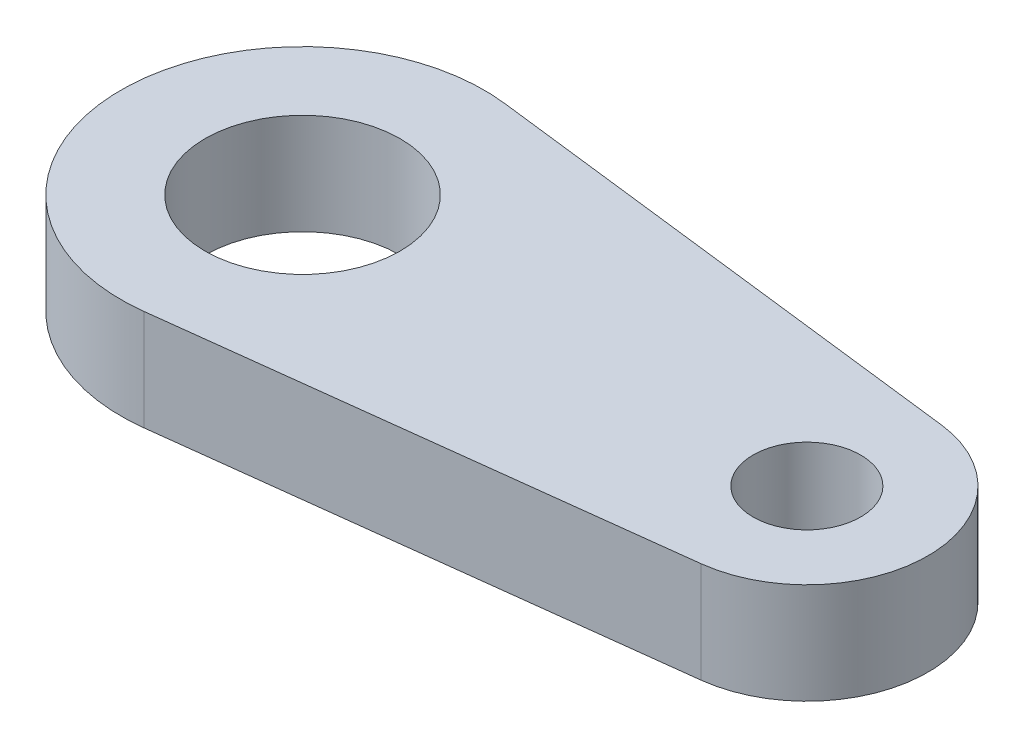
ISO-10303-21;
HEADER;
FILE_DESCRIPTION(('STEP AP214'),'2;1');
FILE_NAME('part.step','',(''),(''),'','','');
FILE_SCHEMA(('AUTOMOTIVE_DESIGN { 1 0 10303 214 1 1 1 1 }'));
ENDSEC;
DATA;
#1=APPLICATION_CONTEXT('core data for automotive mechanical design processes');
#2=APPLICATION_PROTOCOL_DEFINITION('international standard','automotive_design',2000,#1);
#3=PRODUCT_CONTEXT('',#1,'mechanical');
#4=PRODUCT('Part','Part','',(#3));
#5=PRODUCT_RELATED_PRODUCT_CATEGORY('part','',(#4));
#6=PRODUCT_DEFINITION_FORMATION('','',#4);
#7=PRODUCT_DEFINITION_CONTEXT('part definition',#1,'design');
#8=PRODUCT_DEFINITION('design','',#6,#7);
#9=PRODUCT_DEFINITION_SHAPE('','',#8);
#10=(LENGTH_UNIT() NAMED_UNIT(*) SI_UNIT(.MILLI.,.METRE.));
#11=(NAMED_UNIT(*) PLANE_ANGLE_UNIT() SI_UNIT($,.RADIAN.));
#12=(NAMED_UNIT(*) SI_UNIT($,.STERADIAN.) SOLID_ANGLE_UNIT());
#13=UNCERTAINTY_MEASURE_WITH_UNIT(LENGTH_MEASURE(1.E-05),#10,'distance_accuracy_value','');
#14=(GEOMETRIC_REPRESENTATION_CONTEXT(3) GLOBAL_UNCERTAINTY_ASSIGNED_CONTEXT((#13)) GLOBAL_UNIT_ASSIGNED_CONTEXT((#10,
#11,#12)) REPRESENTATION_CONTEXT('',''));
#15=CARTESIAN_POINT('',(0.,0.,0.));
#16=DIRECTION('',(0.,0.,1.));
#17=DIRECTION('',(1.,0.,0.));
#18=AXIS2_PLACEMENT_3D('',#15,#16,#17);
#19=CARTESIAN_POINT('',(15.,3.,0.));
#20=DIRECTION('',(0.,-1.,0.));
#21=DIRECTION('',(0.,0.,-1.));
#22=AXIS2_PLACEMENT_3D('',#19,#20,#21);
#23=CYLINDRICAL_SURFACE('',#22,3.6);
#24=CARTESIAN_POINT('',(15.,0.,0.));
#25=DIRECTION('',(0.,1.,0.));
#26=DIRECTION('',(0.,0.,1.));
#27=AXIS2_PLACEMENT_3D('',#24,#25,#26);
#28=CIRCLE('',#27,3.6);
#29=CARTESIAN_POINT('',(15.432,0.,3.57398601004537));
#30=VERTEX_POINT('',#29);
#31=CARTESIAN_POINT('',(15.432,0.,-3.57398601004537));
#32=VERTEX_POINT('',#31);
#33=EDGE_CURVE('E96',#30,#32,#28,.T.);
#34=ORIENTED_EDGE('',*,*,#33,.T.);
#35=DIRECTION('',(0.,-1.,0.));
#36=VECTOR('',#35,1.);
#37=CARTESIAN_POINT('',(15.432,3.,-3.57398601004537));
#38=LINE('',#37,#36);
#39=CARTESIAN_POINT('',(15.432,3.,-3.57398601004537));
#40=VERTEX_POINT('',#39);
#41=EDGE_CURVE('E11',#40,#32,#38,.T.);
#42=ORIENTED_EDGE('',*,*,#41,.F.);
#43=CARTESIAN_POINT('',(15.,3.,0.));
#44=DIRECTION('',(0.,1.,0.));
#45=DIRECTION('',(0.,0.,1.));
#46=AXIS2_PLACEMENT_3D('',#43,#44,#45);
#47=CIRCLE('',#46,3.6);
#48=CARTESIAN_POINT('',(15.432,3.,3.57398601004537));
#49=VERTEX_POINT('',#48);
#50=EDGE_CURVE('E84',#49,#40,#47,.T.);
#51=ORIENTED_EDGE('',*,*,#50,.F.);
#52=DIRECTION('',(0.,-1.,0.));
#53=VECTOR('',#52,1.);
#54=CARTESIAN_POINT('',(15.432,3.,3.57398601004537));
#55=LINE('',#54,#53);
#56=EDGE_CURVE('E92',#49,#30,#55,.T.);
#57=ORIENTED_EDGE('',*,*,#56,.T.);
#58=EDGE_LOOP('',(#34,#42,#51,#57));
#59=FACE_BOUND('',#58,.T.);
#60=ADVANCED_FACE('F33',(#59),#23,.T.);
#61=CARTESIAN_POINT('',(0.648,3.,-5.36097901506805));
#62=DIRECTION('',(-0.12,0.,0.992773891679269));
#63=DIRECTION('',(0.992773891679269,0.,0.12));
#64=AXIS2_PLACEMENT_3D('',#61,#62,#63);
#65=PLANE('',#64);
#66=DIRECTION('',(-0.992773891679269,0.,-0.12));
#67=VECTOR('',#66,1.);
#68=CARTESIAN_POINT('',(0.648,0.,-5.36097901506805));
#69=LINE('',#68,#67);
#70=CARTESIAN_POINT('',(0.648,0.,-5.36097901506805));
#71=VERTEX_POINT('',#70);
#72=EDGE_CURVE('E88',#32,#71,#69,.T.);
#73=ORIENTED_EDGE('',*,*,#72,.T.);
#74=DIRECTION('',(0.,-1.,0.));
#75=VECTOR('',#74,1.);
#76=CARTESIAN_POINT('',(0.648,3.,-5.36097901506805));
#77=LINE('',#76,#75);
#78=CARTESIAN_POINT('',(0.648,3.,-5.36097901506805));
#79=VERTEX_POINT('',#78);
#80=EDGE_CURVE('E41',#79,#71,#77,.T.);
#81=ORIENTED_EDGE('',*,*,#80,.F.);
#82=DIRECTION('',(-0.992773891679269,0.,-0.12));
#83=VECTOR('',#82,1.);
#84=CARTESIAN_POINT('',(0.648,3.,-5.36097901506805));
#85=LINE('',#84,#83);
#86=EDGE_CURVE('E79',#40,#79,#85,.T.);
#87=ORIENTED_EDGE('',*,*,#86,.F.);
#88=ORIENTED_EDGE('',*,*,#41,.T.);
#89=EDGE_LOOP('',(#73,#81,#87,#88));
#90=FACE_BOUND('',#89,.T.);
#91=ADVANCED_FACE('F87',(#90),#65,.F.);
#92=CARTESIAN_POINT('',(0.,3.,0.));
#93=DIRECTION('',(0.,-1.,0.));
#94=DIRECTION('',(0.,0.,-1.));
#95=AXIS2_PLACEMENT_3D('',#92,#93,#94);
#96=CYLINDRICAL_SURFACE('',#95,5.4);
#97=CARTESIAN_POINT('',(0.,0.,0.));
#98=DIRECTION('',(0.,1.,0.));
#99=DIRECTION('',(0.,0.,1.));
#100=AXIS2_PLACEMENT_3D('',#97,#98,#99);
#101=CIRCLE('',#100,5.4);
#102=CARTESIAN_POINT('',(0.648,0.,5.36097901506805));
#103=VERTEX_POINT('',#102);
#104=EDGE_CURVE('E66',#71,#103,#101,.T.);
#105=ORIENTED_EDGE('',*,*,#104,.T.);
#106=DIRECTION('',(0.,-1.,0.));
#107=VECTOR('',#106,1.);
#108=CARTESIAN_POINT('',(0.648,3.,5.36097901506805));
#109=LINE('',#108,#107);
#110=CARTESIAN_POINT('',(0.648,3.,5.36097901506805));
#111=VERTEX_POINT('',#110);
#112=EDGE_CURVE('E89',#111,#103,#109,.T.);
#113=ORIENTED_EDGE('',*,*,#112,.F.);
#114=CARTESIAN_POINT('',(0.,3.,0.));
#115=DIRECTION('',(0.,1.,0.));
#116=DIRECTION('',(0.,0.,1.));
#117=AXIS2_PLACEMENT_3D('',#114,#115,#116);
#118=CIRCLE('',#117,5.4);
#119=EDGE_CURVE('E82',#79,#111,#118,.T.);
#120=ORIENTED_EDGE('',*,*,#119,.F.);
#121=ORIENTED_EDGE('',*,*,#80,.T.);
#122=EDGE_LOOP('',(#105,#113,#120,#121));
#123=FACE_BOUND('',#122,.T.);
#124=ADVANCED_FACE('F90',(#123),#96,.T.);
#125=CARTESIAN_POINT('',(15.432,3.,3.57398601004537));
#126=DIRECTION('',(-0.12,0.,-0.992773891679269));
#127=DIRECTION('',(-0.992773891679269,0.,0.12));
#128=AXIS2_PLACEMENT_3D('',#125,#126,#127);
#129=PLANE('',#128);
#130=DIRECTION('',(0.992773891679269,0.,-0.12));
#131=VECTOR('',#130,1.);
#132=CARTESIAN_POINT('',(15.432,0.,3.57398601004537));
#133=LINE('',#132,#131);
#134=EDGE_CURVE('E72',#103,#30,#133,.T.);
#135=ORIENTED_EDGE('',*,*,#134,.T.);
#136=ORIENTED_EDGE('',*,*,#56,.F.);
#137=DIRECTION('',(0.992773891679269,0.,-0.12));
#138=VECTOR('',#137,1.);
#139=CARTESIAN_POINT('',(15.432,3.,3.57398601004537));
#140=LINE('',#139,#138);
#141=EDGE_CURVE('E49',#111,#49,#140,.T.);
#142=ORIENTED_EDGE('',*,*,#141,.F.);
#143=ORIENTED_EDGE('',*,*,#112,.T.);
#144=EDGE_LOOP('',(#135,#136,#142,#143));
#145=FACE_BOUND('',#144,.T.);
#146=ADVANCED_FACE('F104',(#145),#129,.F.);
#147=CARTESIAN_POINT('',(15.,3.,0.));
#148=DIRECTION('',(0.,1.,0.));
#149=DIRECTION('',(0.,0.,1.));
#150=AXIS2_PLACEMENT_3D('',#147,#148,#149);
#151=PLANE('',#150);
#152=CARTESIAN_POINT('',(0.,3.,0.));
#153=DIRECTION('',(0.,1.,0.));
#154=DIRECTION('',(0.,0.,1.));
#155=AXIS2_PLACEMENT_3D('',#152,#153,#154);
#156=CIRCLE('',#155,2.9);
#157=CARTESIAN_POINT('',(0.,3.,2.9));
#158=VERTEX_POINT('',#157);
#159=EDGE_CURVE('E116',#158,#158,#156,.T.);
#160=ORIENTED_EDGE('',*,*,#159,.F.);
#161=EDGE_LOOP('',(#160));
#162=FACE_BOUND('',#161,.T.);
#163=CARTESIAN_POINT('',(15.,3.,0.));
#164=DIRECTION('',(0.,1.,0.));
#165=DIRECTION('',(0.,0.,1.));
#166=AXIS2_PLACEMENT_3D('',#163,#164,#165);
#167=CIRCLE('',#166,1.6);
#168=CARTESIAN_POINT('',(15.,3.,1.6));
#169=VERTEX_POINT('',#168);
#170=EDGE_CURVE('E110',#169,#169,#167,.T.);
#171=ORIENTED_EDGE('',*,*,#170,.F.);
#172=EDGE_LOOP('',(#171));
#173=FACE_BOUND('',#172,.T.);
#174=ORIENTED_EDGE('',*,*,#50,.T.);
#175=ORIENTED_EDGE('',*,*,#86,.T.);
#176=ORIENTED_EDGE('',*,*,#119,.T.);
#177=ORIENTED_EDGE('',*,*,#141,.T.);
#178=EDGE_LOOP('',(#174,#175,#176,#177));
#179=FACE_BOUND('',#178,.T.);
#180=ADVANCED_FACE('F80',(#162,#173,#179),#151,.T.);
#181=CARTESIAN_POINT('',(15.,0.,0.));
#182=DIRECTION('',(0.,1.,0.));
#183=DIRECTION('',(0.,0.,1.));
#184=AXIS2_PLACEMENT_3D('',#181,#182,#183);
#185=PLANE('',#184);
#186=CARTESIAN_POINT('',(0.,0.,0.));
#187=DIRECTION('',(0.,1.,0.));
#188=DIRECTION('',(0.,0.,1.));
#189=AXIS2_PLACEMENT_3D('',#186,#187,#188);
#190=CIRCLE('',#189,2.9);
#191=CARTESIAN_POINT('',(0.,0.,2.9));
#192=VERTEX_POINT('',#191);
#193=EDGE_CURVE('E99',#192,#192,#190,.T.);
#194=ORIENTED_EDGE('',*,*,#193,.T.);
#195=EDGE_LOOP('',(#194));
#196=FACE_BOUND('',#195,.T.);
#197=CARTESIAN_POINT('',(15.,0.,0.));
#198=DIRECTION('',(0.,1.,0.));
#199=DIRECTION('',(0.,0.,1.));
#200=AXIS2_PLACEMENT_3D('',#197,#198,#199);
#201=CIRCLE('',#200,1.6);
#202=CARTESIAN_POINT('',(15.,0.,1.6));
#203=VERTEX_POINT('',#202);
#204=EDGE_CURVE('E113',#203,#203,#201,.T.);
#205=ORIENTED_EDGE('',*,*,#204,.T.);
#206=EDGE_LOOP('',(#205));
#207=FACE_BOUND('',#206,.T.);
#208=ORIENTED_EDGE('',*,*,#33,.F.);
#209=ORIENTED_EDGE('',*,*,#134,.F.);
#210=ORIENTED_EDGE('',*,*,#104,.F.);
#211=ORIENTED_EDGE('',*,*,#72,.F.);
#212=EDGE_LOOP('',(#208,#209,#210,#211));
#213=FACE_BOUND('',#212,.T.);
#214=ADVANCED_FACE('F107',(#196,#207,#213),#185,.F.);
#215=CARTESIAN_POINT('',(15.,0.,0.));
#216=DIRECTION('',(0.,1.,0.));
#217=DIRECTION('',(0.,0.,1.));
#218=AXIS2_PLACEMENT_3D('',#215,#216,#217);
#219=CYLINDRICAL_SURFACE('',#218,1.6);
#220=ORIENTED_EDGE('',*,*,#204,.F.);
#221=EDGE_LOOP('',(#220));
#222=FACE_BOUND('',#221,.T.);
#223=ORIENTED_EDGE('',*,*,#170,.T.);
#224=EDGE_LOOP('',(#223));
#225=FACE_BOUND('',#224,.T.);
#226=ADVANCED_FACE('F127',(#222,#225),#219,.F.);
#227=CARTESIAN_POINT('',(0.,0.,0.));
#228=DIRECTION('',(0.,1.,0.));
#229=DIRECTION('',(0.,0.,1.));
#230=AXIS2_PLACEMENT_3D('',#227,#228,#229);
#231=CYLINDRICAL_SURFACE('',#230,2.9);
#232=ORIENTED_EDGE('',*,*,#193,.F.);
#233=EDGE_LOOP('',(#232));
#234=FACE_BOUND('',#233,.T.);
#235=ORIENTED_EDGE('',*,*,#159,.T.);
#236=EDGE_LOOP('',(#235));
#237=FACE_BOUND('',#236,.T.);
#238=ADVANCED_FACE('F124',(#234,#237),#231,.F.);
#239=CLOSED_SHELL('',(#60,#91,#124,#146,#180,#214,#226,#238));
#240=MANIFOLD_SOLID_BREP('B2',#239);
#241=ADVANCED_BREP_SHAPE_REPRESENTATION('',(#18,#240),#14);
#242=SHAPE_DEFINITION_REPRESENTATION(#9,#241);
ENDSEC;
END-ISO-10303-21;
